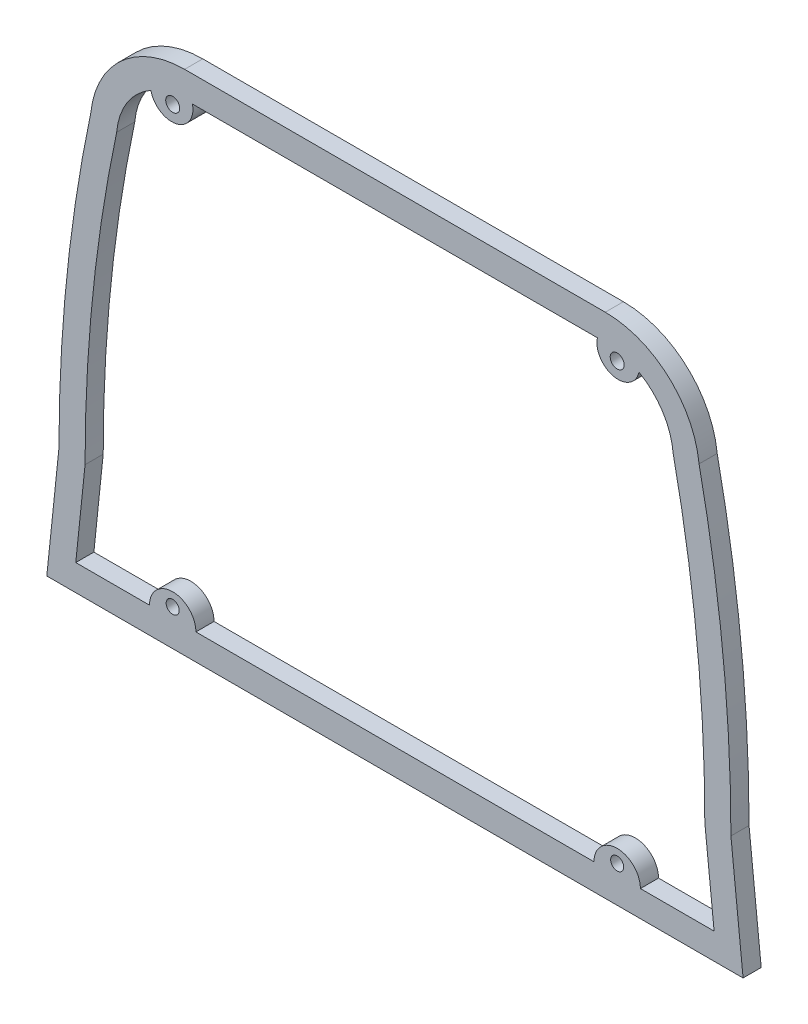
ISO-10303-21;
HEADER;
FILE_DESCRIPTION(('STEP AP214'),'2;1');
FILE_NAME('part.step','',(''),(''),'','','');
FILE_SCHEMA(('AUTOMOTIVE_DESIGN { 1 0 10303 214 1 1 1 1 }'));
ENDSEC;
DATA;
#1=APPLICATION_CONTEXT('core data for automotive mechanical design processes');
#2=APPLICATION_PROTOCOL_DEFINITION('international standard','automotive_design',2000,#1);
#3=PRODUCT_CONTEXT('',#1,'mechanical');
#4=PRODUCT('Part','Part','',(#3));
#5=PRODUCT_RELATED_PRODUCT_CATEGORY('part','',(#4));
#6=PRODUCT_DEFINITION_FORMATION('','',#4);
#7=PRODUCT_DEFINITION_CONTEXT('part definition',#1,'design');
#8=PRODUCT_DEFINITION('design','',#6,#7);
#9=PRODUCT_DEFINITION_SHAPE('','',#8);
#10=(LENGTH_UNIT() NAMED_UNIT(*) SI_UNIT(.MILLI.,.METRE.));
#11=(NAMED_UNIT(*) PLANE_ANGLE_UNIT() SI_UNIT($,.RADIAN.));
#12=(NAMED_UNIT(*) SI_UNIT($,.STERADIAN.) SOLID_ANGLE_UNIT());
#13=UNCERTAINTY_MEASURE_WITH_UNIT(LENGTH_MEASURE(1.E-05),#10,'distance_accuracy_value','');
#14=(GEOMETRIC_REPRESENTATION_CONTEXT(3) GLOBAL_UNCERTAINTY_ASSIGNED_CONTEXT((#13)) GLOBAL_UNIT_ASSIGNED_CONTEXT((#10,
#11,#12)) REPRESENTATION_CONTEXT('',''));
#15=CARTESIAN_POINT('',(0.,0.,0.));
#16=DIRECTION('',(0.,0.,1.));
#17=DIRECTION('',(1.,0.,0.));
#18=AXIS2_PLACEMENT_3D('',#15,#16,#17);
#19=CARTESIAN_POINT('',(100.848111200307,-11.9888000000001,1.5875));
#20=DIRECTION('',(0.,0.,-1.));
#21=DIRECTION('',(-1.,0.,0.));
#22=AXIS2_PLACEMENT_3D('',#19,#20,#21);
#23=CYLINDRICAL_SURFACE('',#22,130.263215676513);
#24=CARTESIAN_POINT('',(100.848111200307,-11.9888000000001,0.));
#25=DIRECTION('',(0.,0.,1.));
#26=DIRECTION('',(1.,0.,0.));
#27=AXIS2_PLACEMENT_3D('',#24,#25,#26);
#28=CIRCLE('',#27,130.263215676513);
#29=CARTESIAN_POINT('',(-29.4151044762055,-11.9888000000001,0.));
#30=VERTEX_POINT('',#29);
#31=CARTESIAN_POINT('',(-26.6256885725934,14.8241768926189,0.));
#32=VERTEX_POINT('',#31);
#33=EDGE_CURVE('E276',#30,#32,#28,.F.);
#34=ORIENTED_EDGE('',*,*,#33,.F.);
#35=DIRECTION('',(0.,0.,-1.));
#36=VECTOR('',#35,1.);
#37=CARTESIAN_POINT('',(-29.4151044762055,-11.9888000000001,1.5875));
#38=LINE('',#37,#36);
#39=CARTESIAN_POINT('',(-29.4151044762055,-11.9888000000001,1.5875));
#40=VERTEX_POINT('',#39);
#41=EDGE_CURVE('E11',#40,#30,#38,.T.);
#42=ORIENTED_EDGE('',*,*,#41,.F.);
#43=CARTESIAN_POINT('',(100.848111200307,-11.9888000000001,1.5875));
#44=DIRECTION('',(0.,0.,1.));
#45=DIRECTION('',(1.,0.,0.));
#46=AXIS2_PLACEMENT_3D('',#43,#44,#45);
#47=CIRCLE('',#46,130.263215676513);
#48=CARTESIAN_POINT('',(-26.6256885725934,14.8241768926189,1.5875));
#49=VERTEX_POINT('',#48);
#50=EDGE_CURVE('E689',#40,#49,#47,.F.);
#51=ORIENTED_EDGE('',*,*,#50,.T.);
#52=DIRECTION('',(0.,0.,-1.));
#53=VECTOR('',#52,1.);
#54=CARTESIAN_POINT('',(-26.6256885725934,14.8241768926189,1.5875));
#55=LINE('',#54,#53);
#56=EDGE_CURVE('E132',#49,#32,#55,.T.);
#57=ORIENTED_EDGE('',*,*,#56,.T.);
#58=EDGE_LOOP('',(#34,#42,#51,#57));
#59=FACE_BOUND('',#58,.T.);
#60=ADVANCED_FACE('F36',(#59),#23,.T.);
#61=CARTESIAN_POINT('',(-33.9203406510145,-55.2949248752893,1.5875));
#62=DIRECTION('',(0.994632171119734,-0.103473881601315,0.));
#63=DIRECTION('',(0.103473881601315,0.994632171119735,0.));
#64=AXIS2_PLACEMENT_3D('',#61,#62,#63);
#65=PLANE('',#64);
#66=DIRECTION('',(-0.103473881601315,-0.994632171119735,0.));
#67=VECTOR('',#66,1.);
#68=CARTESIAN_POINT('',(-33.9203406510145,-55.2949248752893,0.));
#69=LINE('',#68,#67);
#70=CARTESIAN_POINT('',(-30.48,-22.225,0.));
#71=VERTEX_POINT('',#70);
#72=EDGE_CURVE('E278',#30,#71,#69,.T.);
#73=ORIENTED_EDGE('',*,*,#72,.T.);
#74=DIRECTION('',(0.,0.,-1.));
#75=VECTOR('',#74,1.);
#76=CARTESIAN_POINT('',(-30.48,-22.225,1.5875));
#77=LINE('',#76,#75);
#78=CARTESIAN_POINT('',(-30.48,-22.225,1.5875));
#79=VERTEX_POINT('',#78);
#80=EDGE_CURVE('E46',#79,#71,#77,.T.);
#81=ORIENTED_EDGE('',*,*,#80,.F.);
#82=DIRECTION('',(-0.103473881601315,-0.994632171119735,0.));
#83=VECTOR('',#82,1.);
#84=CARTESIAN_POINT('',(-33.9203406510145,-55.2949248752893,1.5875));
#85=LINE('',#84,#83);
#86=EDGE_CURVE('E684',#40,#79,#85,.T.);
#87=ORIENTED_EDGE('',*,*,#86,.F.);
#88=ORIENTED_EDGE('',*,*,#41,.T.);
#89=EDGE_LOOP('',(#73,#81,#87,#88));
#90=FACE_BOUND('',#89,.T.);
#91=ADVANCED_FACE('F418',(#90),#65,.F.);
#92=CARTESIAN_POINT('',(0.,-22.225,1.5875));
#93=DIRECTION('',(0.,1.,0.));
#94=DIRECTION('',(-1.,0.,0.));
#95=AXIS2_PLACEMENT_3D('',#92,#93,#94);
#96=PLANE('',#95);
#97=DIRECTION('',(1.,0.,0.));
#98=VECTOR('',#97,1.);
#99=CARTESIAN_POINT('',(0.,-22.225,0.));
#100=LINE('',#99,#98);
#101=CARTESIAN_POINT('',(30.48,-22.225,0.));
#102=VERTEX_POINT('',#101);
#103=EDGE_CURVE('E281',#71,#102,#100,.T.);
#104=ORIENTED_EDGE('',*,*,#103,.T.);
#105=DIRECTION('',(0.,0.,-1.));
#106=VECTOR('',#105,1.);
#107=CARTESIAN_POINT('',(30.48,-22.225,1.5875));
#108=LINE('',#107,#106);
#109=CARTESIAN_POINT('',(30.48,-22.225,1.5875));
#110=VERTEX_POINT('',#109);
#111=EDGE_CURVE('E312',#110,#102,#108,.T.);
#112=ORIENTED_EDGE('',*,*,#111,.F.);
#113=DIRECTION('',(1.,0.,0.));
#114=VECTOR('',#113,1.);
#115=CARTESIAN_POINT('',(0.,-22.225,1.5875));
#116=LINE('',#115,#114);
#117=EDGE_CURVE('E683',#79,#110,#116,.T.);
#118=ORIENTED_EDGE('',*,*,#117,.F.);
#119=ORIENTED_EDGE('',*,*,#80,.T.);
#120=EDGE_LOOP('',(#104,#112,#118,#119));
#121=FACE_BOUND('',#120,.T.);
#122=ADVANCED_FACE('F423',(#121),#96,.F.);
#123=CARTESIAN_POINT('',(33.9203406510139,-55.2949248752901,1.5875));
#124=DIRECTION('',(0.994632171119737,0.103473881601294,0.));
#125=DIRECTION('',(-0.103473881601294,0.994632171119737,0.));
#126=AXIS2_PLACEMENT_3D('',#123,#124,#125);
#127=PLANE('',#126);
#128=DIRECTION('',(0.103473881601294,-0.994632171119737,0.));
#129=VECTOR('',#128,1.);
#130=CARTESIAN_POINT('',(33.9203406510139,-55.2949248752901,0.));
#131=LINE('',#130,#129);
#132=CARTESIAN_POINT('',(29.4151044762057,-11.9887999999999,0.));
#133=VERTEX_POINT('',#132);
#134=EDGE_CURVE('E284',#133,#102,#131,.T.);
#135=ORIENTED_EDGE('',*,*,#134,.F.);
#136=DIRECTION('',(0.,0.,-1.));
#137=VECTOR('',#136,1.);
#138=CARTESIAN_POINT('',(29.4151044762057,-11.9887999999999,1.5875));
#139=LINE('',#138,#137);
#140=CARTESIAN_POINT('',(29.4151044762057,-11.9887999999999,1.5875));
#141=VERTEX_POINT('',#140);
#142=EDGE_CURVE('E310',#141,#133,#139,.T.);
#143=ORIENTED_EDGE('',*,*,#142,.F.);
#144=DIRECTION('',(0.103473881601294,-0.994632171119737,0.));
#145=VECTOR('',#144,1.);
#146=CARTESIAN_POINT('',(33.9203406510139,-55.2949248752901,1.5875));
#147=LINE('',#146,#145);
#148=EDGE_CURVE('E220',#141,#110,#147,.T.);
#149=ORIENTED_EDGE('',*,*,#148,.T.);
#150=ORIENTED_EDGE('',*,*,#111,.T.);
#151=EDGE_LOOP('',(#135,#143,#149,#150));
#152=FACE_BOUND('',#151,.T.);
#153=ADVANCED_FACE('F641',(#152),#127,.T.);
#154=CARTESIAN_POINT('',(-100.848111200307,-11.9888000000008,1.5875));
#155=DIRECTION('',(0.,0.,-1.));
#156=DIRECTION('',(-1.,0.,0.));
#157=AXIS2_PLACEMENT_3D('',#154,#155,#156);
#158=CYLINDRICAL_SURFACE('',#157,130.263215676513);
#159=CARTESIAN_POINT('',(-100.848111200307,-11.9888000000008,0.));
#160=DIRECTION('',(0.,0.,1.));
#161=DIRECTION('',(1.,0.,0.));
#162=AXIS2_PLACEMENT_3D('',#159,#160,#161);
#163=CIRCLE('',#162,130.263215676513);
#164=CARTESIAN_POINT('',(26.6256885725934,14.824176892619,0.));
#165=VERTEX_POINT('',#164);
#166=EDGE_CURVE('E287',#133,#165,#163,.T.);
#167=ORIENTED_EDGE('',*,*,#166,.T.);
#168=DIRECTION('',(0.,0.,-1.));
#169=VECTOR('',#168,1.);
#170=CARTESIAN_POINT('',(26.6256885725934,14.824176892619,1.5875));
#171=LINE('',#170,#169);
#172=CARTESIAN_POINT('',(26.6256885725934,14.824176892619,1.5875));
#173=VERTEX_POINT('',#172);
#174=EDGE_CURVE('E206',#173,#165,#171,.T.);
#175=ORIENTED_EDGE('',*,*,#174,.F.);
#176=CARTESIAN_POINT('',(-100.848111200307,-11.9888000000008,1.5875));
#177=DIRECTION('',(0.,0.,1.));
#178=DIRECTION('',(1.,0.,0.));
#179=AXIS2_PLACEMENT_3D('',#176,#177,#178);
#180=CIRCLE('',#179,130.263215676513);
#181=EDGE_CURVE('E217',#141,#173,#180,.T.);
#182=ORIENTED_EDGE('',*,*,#181,.F.);
#183=ORIENTED_EDGE('',*,*,#142,.T.);
#184=EDGE_LOOP('',(#167,#175,#182,#183));
#185=FACE_BOUND('',#184,.T.);
#186=ADVANCED_FACE('F633',(#185),#158,.T.);
#187=CARTESIAN_POINT('',(18.415,13.97,1.5875));
#188=DIRECTION('',(0.,0.,-1.));
#189=DIRECTION('',(-1.,0.,0.));
#190=AXIS2_PLACEMENT_3D('',#187,#188,#189);
#191=CYLINDRICAL_SURFACE('',#190,8.25500000000002);
#192=CARTESIAN_POINT('',(18.415,13.97,0.));
#193=DIRECTION('',(0.,0.,1.));
#194=DIRECTION('',(1.,0.,0.));
#195=AXIS2_PLACEMENT_3D('',#192,#193,#194);
#196=CIRCLE('',#195,8.25500000000002);
#197=CARTESIAN_POINT('',(18.415,22.225,0.));
#198=VERTEX_POINT('',#197);
#199=EDGE_CURVE('E203',#198,#165,#196,.F.);
#200=ORIENTED_EDGE('',*,*,#199,.F.);
#201=DIRECTION('',(0.,0.,-1.));
#202=VECTOR('',#201,1.);
#203=CARTESIAN_POINT('',(18.415,22.225,1.5875));
#204=LINE('',#203,#202);
#205=CARTESIAN_POINT('',(18.415,22.225,1.5875));
#206=VERTEX_POINT('',#205);
#207=EDGE_CURVE('E197',#206,#198,#204,.T.);
#208=ORIENTED_EDGE('',*,*,#207,.F.);
#209=CARTESIAN_POINT('',(18.415,13.97,1.5875));
#210=DIRECTION('',(0.,0.,1.));
#211=DIRECTION('',(1.,0.,0.));
#212=AXIS2_PLACEMENT_3D('',#209,#210,#211);
#213=CIRCLE('',#212,8.25500000000002);
#214=EDGE_CURVE('E201',#206,#173,#213,.F.);
#215=ORIENTED_EDGE('',*,*,#214,.T.);
#216=ORIENTED_EDGE('',*,*,#174,.T.);
#217=EDGE_LOOP('',(#200,#208,#215,#216));
#218=FACE_BOUND('',#217,.T.);
#219=ADVANCED_FACE('F199',(#218),#191,.T.);
#220=CARTESIAN_POINT('',(0.,22.225,1.5875));
#221=DIRECTION('',(0.,-1.,0.));
#222=DIRECTION('',(1.,0.,0.));
#223=AXIS2_PLACEMENT_3D('',#220,#221,#222);
#224=PLANE('',#223);
#225=DIRECTION('',(-1.,0.,0.));
#226=VECTOR('',#225,1.);
#227=CARTESIAN_POINT('',(0.,22.225,0.));
#228=LINE('',#227,#226);
#229=CARTESIAN_POINT('',(-18.415,22.225,0.));
#230=VERTEX_POINT('',#229);
#231=EDGE_CURVE('E291',#198,#230,#228,.T.);
#232=ORIENTED_EDGE('',*,*,#231,.T.);
#233=DIRECTION('',(0.,0.,-1.));
#234=VECTOR('',#233,1.);
#235=CARTESIAN_POINT('',(-18.415,22.225,1.5875));
#236=LINE('',#235,#234);
#237=CARTESIAN_POINT('',(-18.415,22.225,1.5875));
#238=VERTEX_POINT('',#237);
#239=EDGE_CURVE('E207',#238,#230,#236,.T.);
#240=ORIENTED_EDGE('',*,*,#239,.F.);
#241=DIRECTION('',(-1.,0.,0.));
#242=VECTOR('',#241,1.);
#243=CARTESIAN_POINT('',(0.,22.225,1.5875));
#244=LINE('',#243,#242);
#245=EDGE_CURVE('E210',#206,#238,#244,.T.);
#246=ORIENTED_EDGE('',*,*,#245,.F.);
#247=ORIENTED_EDGE('',*,*,#207,.T.);
#248=EDGE_LOOP('',(#232,#240,#246,#247));
#249=FACE_BOUND('',#248,.T.);
#250=ADVANCED_FACE('F211',(#249),#224,.F.);
#251=CARTESIAN_POINT('',(-18.415,13.97,1.5875));
#252=DIRECTION('',(0.,0.,-1.));
#253=DIRECTION('',(-1.,0.,0.));
#254=AXIS2_PLACEMENT_3D('',#251,#252,#253);
#255=CYLINDRICAL_SURFACE('',#254,5.96900000000001);
#256=CARTESIAN_POINT('',(-18.415,13.97,0.));
#257=DIRECTION('',(0.,0.,1.));
#258=DIRECTION('',(1.,0.,0.));
#259=AXIS2_PLACEMENT_3D('',#256,#257,#258);
#260=CIRCLE('',#259,5.96900000000001);
#261=CARTESIAN_POINT('',(-21.365471992299,19.1588029469868,0.));
#262=VERTEX_POINT('',#261);
#263=CARTESIAN_POINT('',(-24.3622943207271,14.4785776859514,0.));
#264=VERTEX_POINT('',#263);
#265=EDGE_CURVE('E238',#262,#264,#260,.T.);
#266=ORIENTED_EDGE('',*,*,#265,.F.);
#267=DIRECTION('',(0.,0.,-1.));
#268=VECTOR('',#267,1.);
#269=CARTESIAN_POINT('',(-21.365471992299,19.1588029469868,1.5875));
#270=LINE('',#269,#268);
#271=CARTESIAN_POINT('',(-21.365471992299,19.1588029469868,1.5875));
#272=VERTEX_POINT('',#271);
#273=EDGE_CURVE('E40',#272,#262,#270,.T.);
#274=ORIENTED_EDGE('',*,*,#273,.F.);
#275=CARTESIAN_POINT('',(-18.415,13.97,1.5875));
#276=DIRECTION('',(0.,0.,1.));
#277=DIRECTION('',(1.,0.,0.));
#278=AXIS2_PLACEMENT_3D('',#275,#276,#277);
#279=CIRCLE('',#278,5.96900000000001);
#280=CARTESIAN_POINT('',(-24.3622943207271,14.4785776859514,1.5875));
#281=VERTEX_POINT('',#280);
#282=EDGE_CURVE('E306',#272,#281,#279,.T.);
#283=ORIENTED_EDGE('',*,*,#282,.T.);
#284=DIRECTION('',(0.,0.,-1.));
#285=VECTOR('',#284,1.);
#286=CARTESIAN_POINT('',(-24.3622943207271,14.4785776859514,1.5875));
#287=LINE('',#286,#285);
#288=EDGE_CURVE('E237',#281,#264,#287,.T.);
#289=ORIENTED_EDGE('',*,*,#288,.T.);
#290=EDGE_LOOP('',(#266,#274,#283,#289));
#291=FACE_BOUND('',#290,.T.);
#292=ADVANCED_FACE('F38',(#291),#255,.F.);
#293=CARTESIAN_POINT('',(-19.545370171903,19.5489014734934,1.5875));
#294=DIRECTION('',(0.,0.,-1.));
#295=DIRECTION('',(-1.,0.,0.));
#296=AXIS2_PLACEMENT_3D('',#293,#294,#295);
#297=CYLINDRICAL_SURFACE('',#296,1.86143694413519);
#298=CARTESIAN_POINT('',(-19.545370171903,19.5489014734934,0.));
#299=DIRECTION('',(0.,0.,1.));
#300=DIRECTION('',(1.,0.,0.));
#301=AXIS2_PLACEMENT_3D('',#298,#299,#300);
#302=CIRCLE('',#301,1.86143694413519);
#303=CARTESIAN_POINT('',(-17.7252683515071,19.939,0.));
#304=VERTEX_POINT('',#303);
#305=EDGE_CURVE('E241',#262,#304,#302,.T.);
#306=ORIENTED_EDGE('',*,*,#305,.T.);
#307=DIRECTION('',(0.,0.,-1.));
#308=VECTOR('',#307,1.);
#309=CARTESIAN_POINT('',(-17.7252683515071,19.939,1.5875));
#310=LINE('',#309,#308);
#311=CARTESIAN_POINT('',(-17.7252683515071,19.939,1.5875));
#312=VERTEX_POINT('',#311);
#313=EDGE_CURVE('E338',#312,#304,#310,.T.);
#314=ORIENTED_EDGE('',*,*,#313,.F.);
#315=CARTESIAN_POINT('',(-19.545370171903,19.5489014734934,1.5875));
#316=DIRECTION('',(0.,0.,1.));
#317=DIRECTION('',(1.,0.,0.));
#318=AXIS2_PLACEMENT_3D('',#315,#316,#317);
#319=CIRCLE('',#318,1.86143694413519);
#320=EDGE_CURVE('E346',#272,#312,#319,.T.);
#321=ORIENTED_EDGE('',*,*,#320,.F.);
#322=ORIENTED_EDGE('',*,*,#273,.T.);
#323=EDGE_LOOP('',(#306,#314,#321,#322));
#324=FACE_BOUND('',#323,.T.);
#325=ADVANCED_FACE('F345',(#324),#297,.T.);
#326=CARTESIAN_POINT('',(0.,19.939,1.5875));
#327=DIRECTION('',(0.,-1.,0.));
#328=DIRECTION('',(1.,0.,0.));
#329=AXIS2_PLACEMENT_3D('',#326,#327,#328);
#330=PLANE('',#329);
#331=DIRECTION('',(-1.,0.,0.));
#332=VECTOR('',#331,1.);
#333=CARTESIAN_POINT('',(0.,19.939,0.));
#334=LINE('',#333,#332);
#335=CARTESIAN_POINT('',(17.725268351507,19.939,0.));
#336=VERTEX_POINT('',#335);
#337=EDGE_CURVE('E244',#336,#304,#334,.T.);
#338=ORIENTED_EDGE('',*,*,#337,.F.);
#339=DIRECTION('',(0.,0.,-1.));
#340=VECTOR('',#339,1.);
#341=CARTESIAN_POINT('',(17.725268351507,19.939,1.5875));
#342=LINE('',#341,#340);
#343=CARTESIAN_POINT('',(17.725268351507,19.939,1.5875));
#344=VERTEX_POINT('',#343);
#345=EDGE_CURVE('E337',#344,#336,#342,.T.);
#346=ORIENTED_EDGE('',*,*,#345,.F.);
#347=DIRECTION('',(-1.,0.,0.));
#348=VECTOR('',#347,1.);
#349=CARTESIAN_POINT('',(0.,19.939,1.5875));
#350=LINE('',#349,#348);
#351=EDGE_CURVE('E706',#344,#312,#350,.T.);
#352=ORIENTED_EDGE('',*,*,#351,.T.);
#353=ORIENTED_EDGE('',*,*,#313,.T.);
#354=EDGE_LOOP('',(#338,#346,#352,#353));
#355=FACE_BOUND('',#354,.T.);
#356=ADVANCED_FACE('F409',(#355),#330,.T.);
#357=CARTESIAN_POINT('',(19.545370171903,19.5489014734936,1.5875));
#358=DIRECTION('',(0.,0.,-1.));
#359=DIRECTION('',(-1.,0.,0.));
#360=AXIS2_PLACEMENT_3D('',#357,#358,#359);
#361=CYLINDRICAL_SURFACE('',#360,1.86143694413519);
#362=CARTESIAN_POINT('',(19.545370171903,19.5489014734936,0.));
#363=DIRECTION('',(0.,0.,1.));
#364=DIRECTION('',(1.,0.,0.));
#365=AXIS2_PLACEMENT_3D('',#362,#363,#364);
#366=CIRCLE('',#365,1.86143694413519);
#367=CARTESIAN_POINT('',(21.365471992299,19.1588029469869,0.));
#368=VERTEX_POINT('',#367);
#369=EDGE_CURVE('E247',#368,#336,#366,.F.);
#370=ORIENTED_EDGE('',*,*,#369,.F.);
#371=DIRECTION('',(0.,0.,-1.));
#372=VECTOR('',#371,1.);
#373=CARTESIAN_POINT('',(21.365471992299,19.1588029469869,1.5875));
#374=LINE('',#373,#372);
#375=CARTESIAN_POINT('',(21.365471992299,19.1588029469869,1.5875));
#376=VERTEX_POINT('',#375);
#377=EDGE_CURVE('E335',#376,#368,#374,.T.);
#378=ORIENTED_EDGE('',*,*,#377,.F.);
#379=CARTESIAN_POINT('',(19.545370171903,19.5489014734936,1.5875));
#380=DIRECTION('',(0.,0.,1.));
#381=DIRECTION('',(1.,0.,0.));
#382=AXIS2_PLACEMENT_3D('',#379,#380,#381);
#383=CIRCLE('',#382,1.86143694413519);
#384=EDGE_CURVE('E407',#376,#344,#383,.F.);
#385=ORIENTED_EDGE('',*,*,#384,.T.);
#386=ORIENTED_EDGE('',*,*,#345,.T.);
#387=EDGE_LOOP('',(#370,#378,#385,#386));
#388=FACE_BOUND('',#387,.T.);
#389=ADVANCED_FACE('F404',(#388),#361,.T.);
#390=CARTESIAN_POINT('',(18.415,13.97,1.5875));
#391=DIRECTION('',(0.,0.,-1.));
#392=DIRECTION('',(-1.,0.,0.));
#393=AXIS2_PLACEMENT_3D('',#390,#391,#392);
#394=CYLINDRICAL_SURFACE('',#393,5.96900000000002);
#395=CARTESIAN_POINT('',(18.415,13.97,0.));
#396=DIRECTION('',(0.,0.,1.));
#397=DIRECTION('',(1.,0.,0.));
#398=AXIS2_PLACEMENT_3D('',#395,#396,#397);
#399=CIRCLE('',#398,5.96900000000002);
#400=CARTESIAN_POINT('',(24.362294320727,14.4785776859518,0.));
#401=VERTEX_POINT('',#400);
#402=EDGE_CURVE('E250',#368,#401,#399,.F.);
#403=ORIENTED_EDGE('',*,*,#402,.T.);
#404=DIRECTION('',(0.,0.,-1.));
#405=VECTOR('',#404,1.);
#406=CARTESIAN_POINT('',(24.362294320727,14.4785776859518,1.5875));
#407=LINE('',#406,#405);
#408=CARTESIAN_POINT('',(24.362294320727,14.4785776859518,1.5875));
#409=VERTEX_POINT('',#408);
#410=EDGE_CURVE('E333',#409,#401,#407,.T.);
#411=ORIENTED_EDGE('',*,*,#410,.F.);
#412=CARTESIAN_POINT('',(18.415,13.97,1.5875));
#413=DIRECTION('',(0.,0.,1.));
#414=DIRECTION('',(1.,0.,0.));
#415=AXIS2_PLACEMENT_3D('',#412,#413,#414);
#416=CIRCLE('',#415,5.96900000000002);
#417=EDGE_CURVE('E703',#376,#409,#416,.F.);
#418=ORIENTED_EDGE('',*,*,#417,.F.);
#419=ORIENTED_EDGE('',*,*,#377,.T.);
#420=EDGE_LOOP('',(#403,#411,#418,#419));
#421=FACE_BOUND('',#420,.T.);
#422=ADVANCED_FACE('F401',(#421),#394,.F.);
#423=CARTESIAN_POINT('',(-100.848111200307,-11.9888000000008,1.5875));
#424=DIRECTION('',(0.,0.,-1.));
#425=DIRECTION('',(-1.,0.,0.));
#426=AXIS2_PLACEMENT_3D('',#423,#424,#425);
#427=CYLINDRICAL_SURFACE('',#426,127.977215676513);
#428=CARTESIAN_POINT('',(-100.848111200307,-11.9888000000008,0.));
#429=DIRECTION('',(0.,0.,1.));
#430=DIRECTION('',(1.,0.,0.));
#431=AXIS2_PLACEMENT_3D('',#428,#429,#430);
#432=CIRCLE('',#431,127.977215676513);
#433=CARTESIAN_POINT('',(27.1290500155386,-12.1068654315829,0.));
#434=VERTEX_POINT('',#433);
#435=EDGE_CURVE('E253',#434,#401,#432,.T.);
#436=ORIENTED_EDGE('',*,*,#435,.F.);
#437=DIRECTION('',(0.,0.,-1.));
#438=VECTOR('',#437,1.);
#439=CARTESIAN_POINT('',(27.1290500155386,-12.1068654315829,1.5875));
#440=LINE('',#439,#438);
#441=CARTESIAN_POINT('',(27.1290500155386,-12.1068654315829,1.5875));
#442=VERTEX_POINT('',#441);
#443=EDGE_CURVE('E331',#442,#434,#440,.T.);
#444=ORIENTED_EDGE('',*,*,#443,.F.);
#445=CARTESIAN_POINT('',(-100.848111200307,-11.9888000000008,1.5875));
#446=DIRECTION('',(0.,0.,1.));
#447=DIRECTION('',(1.,0.,0.));
#448=AXIS2_PLACEMENT_3D('',#445,#446,#447);
#449=CIRCLE('',#448,127.977215676513);
#450=EDGE_CURVE('E398',#442,#409,#449,.T.);
#451=ORIENTED_EDGE('',*,*,#450,.T.);
#452=ORIENTED_EDGE('',*,*,#410,.T.);
#453=EDGE_LOOP('',(#436,#444,#451,#452));
#454=FACE_BOUND('',#453,.T.);
#455=ADVANCED_FACE('F393',(#454),#427,.F.);
#456=CARTESIAN_POINT('',(31.6466115078347,-55.5314661686301,1.5875));
#457=DIRECTION('',(0.994632171119735,0.103473881601311,0.));
#458=DIRECTION('',(-0.103473881601311,0.994632171119735,0.));
#459=AXIS2_PLACEMENT_3D('',#456,#457,#458);
#460=PLANE('',#459);
#461=DIRECTION('',(0.103473881601311,-0.994632171119735,0.));
#462=VECTOR('',#461,1.);
#463=CARTESIAN_POINT('',(31.6466115078347,-55.5314661686301,0.));
#464=LINE('',#463,#462);
#465=CARTESIAN_POINT('',(27.9438450609326,-19.939,0.));
#466=VERTEX_POINT('',#465);
#467=EDGE_CURVE('E256',#434,#466,#464,.T.);
#468=ORIENTED_EDGE('',*,*,#467,.T.);
#469=DIRECTION('',(0.,0.,-1.));
#470=VECTOR('',#469,1.);
#471=CARTESIAN_POINT('',(27.9438450609326,-19.939,1.5875));
#472=LINE('',#471,#470);
#473=CARTESIAN_POINT('',(27.9438450609326,-19.939,1.5875));
#474=VERTEX_POINT('',#473);
#475=EDGE_CURVE('E329',#474,#466,#472,.T.);
#476=ORIENTED_EDGE('',*,*,#475,.F.);
#477=DIRECTION('',(0.103473881601311,-0.994632171119735,0.));
#478=VECTOR('',#477,1.);
#479=CARTESIAN_POINT('',(31.6466115078347,-55.5314661686301,1.5875));
#480=LINE('',#479,#478);
#481=EDGE_CURVE('E700',#442,#474,#480,.T.);
#482=ORIENTED_EDGE('',*,*,#481,.F.);
#483=ORIENTED_EDGE('',*,*,#443,.T.);
#484=EDGE_LOOP('',(#468,#476,#482,#483));
#485=FACE_BOUND('',#484,.T.);
#486=ADVANCED_FACE('F443',(#485),#460,.F.);
#487=CARTESIAN_POINT('',(0.,-19.939,1.5875));
#488=DIRECTION('',(0.,1.,0.));
#489=DIRECTION('',(0.,0.,1.));
#490=AXIS2_PLACEMENT_3D('',#487,#488,#489);
#491=PLANE('',#490);
#492=DIRECTION('',(1.,0.,0.));
#493=VECTOR('',#492,1.);
#494=CARTESIAN_POINT('',(0.,-19.939,0.));
#495=LINE('',#494,#493);
#496=CARTESIAN_POINT('',(21.4895288552225,-19.939,0.));
#497=VERTEX_POINT('',#496);
#498=EDGE_CURVE('E259',#497,#466,#495,.T.);
#499=ORIENTED_EDGE('',*,*,#498,.F.);
#500=DIRECTION('',(0.,0.,-1.));
#501=VECTOR('',#500,1.);
#502=CARTESIAN_POINT('',(21.4895288552225,-19.939,1.5875));
#503=LINE('',#502,#501);
#504=CARTESIAN_POINT('',(21.4895288552225,-19.939,1.5875));
#505=VERTEX_POINT('',#504);
#506=EDGE_CURVE('E327',#505,#497,#503,.T.);
#507=ORIENTED_EDGE('',*,*,#506,.F.);
#508=DIRECTION('',(1.,0.,0.));
#509=VECTOR('',#508,1.);
#510=CARTESIAN_POINT('',(0.,-19.939,1.5875));
#511=LINE('',#510,#509);
#512=EDGE_CURVE('E386',#505,#474,#511,.T.);
#513=ORIENTED_EDGE('',*,*,#512,.T.);
#514=ORIENTED_EDGE('',*,*,#475,.T.);
#515=EDGE_LOOP('',(#499,#507,#513,#514));
#516=FACE_BOUND('',#515,.T.);
#517=ADVANCED_FACE('F385',(#516),#491,.T.);
#518=CARTESIAN_POINT('',(19.4575288552225,-19.9389999999999,1.5875));
#519=DIRECTION('',(0.,0.,-1.));
#520=DIRECTION('',(-1.,0.,0.));
#521=AXIS2_PLACEMENT_3D('',#518,#519,#520);
#522=CYLINDRICAL_SURFACE('',#521,2.032);
#523=CARTESIAN_POINT('',(19.4575288552225,-19.9389999999999,0.));
#524=DIRECTION('',(0.,0.,1.));
#525=DIRECTION('',(1.,0.,0.));
#526=AXIS2_PLACEMENT_3D('',#523,#524,#525);
#527=CIRCLE('',#526,2.032);
#528=CARTESIAN_POINT('',(17.4255288552225,-19.939,0.));
#529=VERTEX_POINT('',#528);
#530=EDGE_CURVE('E262',#497,#529,#527,.T.);
#531=ORIENTED_EDGE('',*,*,#530,.T.);
#532=DIRECTION('',(0.,0.,-1.));
#533=VECTOR('',#532,1.);
#534=CARTESIAN_POINT('',(17.4255288552225,-19.939,1.5875));
#535=LINE('',#534,#533);
#536=CARTESIAN_POINT('',(17.4255288552225,-19.939,1.5875));
#537=VERTEX_POINT('',#536);
#538=EDGE_CURVE('E325',#537,#529,#535,.T.);
#539=ORIENTED_EDGE('',*,*,#538,.F.);
#540=CARTESIAN_POINT('',(19.4575288552225,-19.9389999999999,1.5875));
#541=DIRECTION('',(0.,0.,1.));
#542=DIRECTION('',(1.,0.,0.));
#543=AXIS2_PLACEMENT_3D('',#540,#541,#542);
#544=CIRCLE('',#543,2.032);
#545=EDGE_CURVE('E381',#505,#537,#544,.T.);
#546=ORIENTED_EDGE('',*,*,#545,.F.);
#547=ORIENTED_EDGE('',*,*,#506,.T.);
#548=EDGE_LOOP('',(#531,#539,#546,#547));
#549=FACE_BOUND('',#548,.T.);
#550=ADVANCED_FACE('F380',(#549),#522,.T.);
#551=CARTESIAN_POINT('',(-17.4255288552222,-19.939,0.));
#552=VERTEX_POINT('',#551);
#553=EDGE_CURVE('E264',#552,#529,#495,.T.);
#554=ORIENTED_EDGE('',*,*,#553,.F.);
#555=DIRECTION('',(0.,0.,-1.));
#556=VECTOR('',#555,1.);
#557=CARTESIAN_POINT('',(-17.4255288552222,-19.939,1.5875));
#558=LINE('',#557,#556);
#559=CARTESIAN_POINT('',(-17.4255288552222,-19.939,1.5875));
#560=VERTEX_POINT('',#559);
#561=EDGE_CURVE('E323',#560,#552,#558,.T.);
#562=ORIENTED_EDGE('',*,*,#561,.F.);
#563=EDGE_CURVE('E377',#560,#537,#511,.T.);
#564=ORIENTED_EDGE('',*,*,#563,.T.);
#565=ORIENTED_EDGE('',*,*,#538,.T.);
#566=EDGE_LOOP('',(#554,#562,#564,#565));
#567=FACE_BOUND('',#566,.T.);
#568=ADVANCED_FACE('F373',(#567),#491,.T.);
#569=CARTESIAN_POINT('',(-19.4575288552222,-19.939,1.5875));
#570=DIRECTION('',(0.,0.,-1.));
#571=DIRECTION('',(-1.,0.,0.));
#572=AXIS2_PLACEMENT_3D('',#569,#570,#571);
#573=CYLINDRICAL_SURFACE('',#572,2.032);
#574=CARTESIAN_POINT('',(-19.4575288552222,-19.939,0.));
#575=DIRECTION('',(0.,0.,1.));
#576=DIRECTION('',(1.,0.,0.));
#577=AXIS2_PLACEMENT_3D('',#574,#575,#576);
#578=CIRCLE('',#577,2.032);
#579=CARTESIAN_POINT('',(-21.4895288552222,-19.939,0.));
#580=VERTEX_POINT('',#579);
#581=EDGE_CURVE('E267',#580,#552,#578,.F.);
#582=ORIENTED_EDGE('',*,*,#581,.F.);
#583=DIRECTION('',(0.,0.,-1.));
#584=VECTOR('',#583,1.);
#585=CARTESIAN_POINT('',(-21.4895288552222,-19.939,1.5875));
#586=LINE('',#585,#584);
#587=CARTESIAN_POINT('',(-21.4895288552222,-19.939,1.5875));
#588=VERTEX_POINT('',#587);
#589=EDGE_CURVE('E321',#588,#580,#586,.T.);
#590=ORIENTED_EDGE('',*,*,#589,.F.);
#591=CARTESIAN_POINT('',(-19.4575288552222,-19.939,1.5875));
#592=DIRECTION('',(0.,0.,1.));
#593=DIRECTION('',(1.,0.,0.));
#594=AXIS2_PLACEMENT_3D('',#591,#592,#593);
#595=CIRCLE('',#594,2.032);
#596=EDGE_CURVE('E695',#588,#560,#595,.F.);
#597=ORIENTED_EDGE('',*,*,#596,.T.);
#598=ORIENTED_EDGE('',*,*,#561,.T.);
#599=EDGE_LOOP('',(#582,#590,#597,#598));
#600=FACE_BOUND('',#599,.T.);
#601=ADVANCED_FACE('F437',(#600),#573,.T.);
#602=CARTESIAN_POINT('',(-27.9438450609326,-19.939,0.));
#603=VERTEX_POINT('',#602);
#604=EDGE_CURVE('E263',#603,#580,#495,.T.);
#605=ORIENTED_EDGE('',*,*,#604,.F.);
#606=DIRECTION('',(0.,0.,-1.));
#607=VECTOR('',#606,1.);
#608=CARTESIAN_POINT('',(-27.9438450609326,-19.939,1.5875));
#609=LINE('',#608,#607);
#610=CARTESIAN_POINT('',(-27.9438450609326,-19.939,1.5875));
#611=VERTEX_POINT('',#610);
#612=EDGE_CURVE('E319',#611,#603,#609,.T.);
#613=ORIENTED_EDGE('',*,*,#612,.F.);
#614=EDGE_CURVE('E694',#611,#588,#511,.T.);
#615=ORIENTED_EDGE('',*,*,#614,.T.);
#616=ORIENTED_EDGE('',*,*,#589,.T.);
#617=EDGE_LOOP('',(#605,#613,#615,#616));
#618=FACE_BOUND('',#617,.T.);
#619=ADVANCED_FACE('F366',(#618),#491,.T.);
#620=CARTESIAN_POINT('',(-31.6466115078347,-55.53146616863,1.5875));
#621=DIRECTION('',(0.994632171119735,-0.103473881601311,0.));
#622=DIRECTION('',(0.103473881601311,0.994632171119735,0.));
#623=AXIS2_PLACEMENT_3D('',#620,#621,#622);
#624=PLANE('',#623);
#625=DIRECTION('',(-0.103473881601311,-0.994632171119735,0.));
#626=VECTOR('',#625,1.);
#627=CARTESIAN_POINT('',(-31.6466115078347,-55.53146616863,0.));
#628=LINE('',#627,#626);
#629=CARTESIAN_POINT('',(-27.1290500155383,-12.1068654315809,0.));
#630=VERTEX_POINT('',#629);
#631=EDGE_CURVE('E270',#630,#603,#628,.T.);
#632=ORIENTED_EDGE('',*,*,#631,.F.);
#633=DIRECTION('',(0.,0.,-1.));
#634=VECTOR('',#633,1.);
#635=CARTESIAN_POINT('',(-27.1290500155383,-12.1068654315809,1.5875));
#636=LINE('',#635,#634);
#637=CARTESIAN_POINT('',(-27.1290500155383,-12.1068654315809,1.5875));
#638=VERTEX_POINT('',#637);
#639=EDGE_CURVE('E317',#638,#630,#636,.T.);
#640=ORIENTED_EDGE('',*,*,#639,.F.);
#641=DIRECTION('',(-0.103473881601311,-0.994632171119735,0.));
#642=VECTOR('',#641,1.);
#643=CARTESIAN_POINT('',(-31.6466115078347,-55.53146616863,1.5875));
#644=LINE('',#643,#642);
#645=EDGE_CURVE('E362',#638,#611,#644,.T.);
#646=ORIENTED_EDGE('',*,*,#645,.T.);
#647=ORIENTED_EDGE('',*,*,#612,.T.);
#648=EDGE_LOOP('',(#632,#640,#646,#647));
#649=FACE_BOUND('',#648,.T.);
#650=ADVANCED_FACE('F358',(#649),#624,.T.);
#651=CARTESIAN_POINT('',(19.4575288552223,-19.05,1.5875));
#652=DIRECTION('',(0.,0.,-1.));
#653=DIRECTION('',(-1.,0.,0.));
#654=AXIS2_PLACEMENT_3D('',#651,#652,#653);
#655=CYLINDRICAL_SURFACE('',#654,0.571499999999999);
#656=CARTESIAN_POINT('',(19.4575288552223,-19.05,1.5875));
#657=DIRECTION('',(0.,0.,1.));
#658=DIRECTION('',(1.,0.,0.));
#659=AXIS2_PLACEMENT_3D('',#656,#657,#658);
#660=CIRCLE('',#659,0.571499999999999);
#661=CARTESIAN_POINT('',(20.0290288552223,-19.05,1.5875));
#662=VERTEX_POINT('',#661);
#663=EDGE_CURVE('E231',#662,#662,#660,.T.);
#664=ORIENTED_EDGE('',*,*,#663,.T.);
#665=EDGE_LOOP('',(#664));
#666=FACE_BOUND('',#665,.T.);
#667=CARTESIAN_POINT('',(19.4575288552223,-19.05,0.));
#668=DIRECTION('',(0.,0.,1.));
#669=DIRECTION('',(1.,0.,0.));
#670=AXIS2_PLACEMENT_3D('',#667,#668,#669);
#671=CIRCLE('',#670,0.571499999999999);
#672=CARTESIAN_POINT('',(20.0290288552223,-19.05,0.));
#673=VERTEX_POINT('',#672);
#674=EDGE_CURVE('E300',#673,#673,#671,.T.);
#675=ORIENTED_EDGE('',*,*,#674,.F.);
#676=EDGE_LOOP('',(#675));
#677=FACE_BOUND('',#676,.T.);
#678=ADVANCED_FACE('F434',(#666,#677),#655,.F.);
#679=CARTESIAN_POINT('',(-19.4575288552221,19.05,1.5875));
#680=DIRECTION('',(0.,0.,-1.));
#681=DIRECTION('',(-1.,0.,0.));
#682=AXIS2_PLACEMENT_3D('',#679,#680,#681);
#683=CYLINDRICAL_SURFACE('',#682,0.609599999999999);
#684=CARTESIAN_POINT('',(-19.4575288552221,19.05,1.5875));
#685=DIRECTION('',(0.,0.,1.));
#686=DIRECTION('',(1.,0.,0.));
#687=AXIS2_PLACEMENT_3D('',#684,#685,#686);
#688=CIRCLE('',#687,0.609599999999999);
#689=CARTESIAN_POINT('',(-18.8479288552221,19.05,1.5875));
#690=VERTEX_POINT('',#689);
#691=EDGE_CURVE('E228',#690,#690,#688,.T.);
#692=ORIENTED_EDGE('',*,*,#691,.T.);
#693=EDGE_LOOP('',(#692));
#694=FACE_BOUND('',#693,.T.);
#695=CARTESIAN_POINT('',(-19.4575288552221,19.05,0.));
#696=DIRECTION('',(0.,0.,1.));
#697=DIRECTION('',(1.,0.,0.));
#698=AXIS2_PLACEMENT_3D('',#695,#696,#697);
#699=CIRCLE('',#698,0.609599999999999);
#700=CARTESIAN_POINT('',(-18.8479288552221,19.05,0.));
#701=VERTEX_POINT('',#700);
#702=EDGE_CURVE('E297',#701,#701,#699,.T.);
#703=ORIENTED_EDGE('',*,*,#702,.F.);
#704=EDGE_LOOP('',(#703));
#705=FACE_BOUND('',#704,.T.);
#706=ADVANCED_FACE('F493',(#694,#705),#683,.F.);
#707=CARTESIAN_POINT('',(19.4575288552221,19.05,1.5875));
#708=DIRECTION('',(0.,0.,-1.));
#709=DIRECTION('',(-1.,0.,0.));
#710=AXIS2_PLACEMENT_3D('',#707,#708,#709);
#711=CYLINDRICAL_SURFACE('',#710,0.609599999999999);
#712=CARTESIAN_POINT('',(19.4575288552221,19.05,1.5875));
#713=DIRECTION('',(0.,0.,1.));
#714=DIRECTION('',(1.,0.,0.));
#715=AXIS2_PLACEMENT_3D('',#712,#713,#714);
#716=CIRCLE('',#715,0.609599999999999);
#717=CARTESIAN_POINT('',(20.0671288552221,19.05,1.5875));
#718=VERTEX_POINT('',#717);
#719=EDGE_CURVE('E225',#718,#718,#716,.F.);
#720=ORIENTED_EDGE('',*,*,#719,.F.);
#721=EDGE_LOOP('',(#720));
#722=FACE_BOUND('',#721,.T.);
#723=CARTESIAN_POINT('',(19.4575288552221,19.05,0.));
#724=DIRECTION('',(0.,0.,1.));
#725=DIRECTION('',(1.,0.,0.));
#726=AXIS2_PLACEMENT_3D('',#723,#724,#725);
#727=CIRCLE('',#726,0.609599999999999);
#728=CARTESIAN_POINT('',(20.0671288552221,19.05,0.));
#729=VERTEX_POINT('',#728);
#730=EDGE_CURVE('E294',#729,#729,#727,.F.);
#731=ORIENTED_EDGE('',*,*,#730,.T.);
#732=EDGE_LOOP('',(#731));
#733=FACE_BOUND('',#732,.T.);
#734=ADVANCED_FACE('F501',(#722,#733),#711,.F.);
#735=CARTESIAN_POINT('',(-18.415,13.97,1.5875));
#736=DIRECTION('',(0.,0.,-1.));
#737=DIRECTION('',(-1.,0.,0.));
#738=AXIS2_PLACEMENT_3D('',#735,#736,#737);
#739=CYLINDRICAL_SURFACE('',#738,8.255);
#740=CARTESIAN_POINT('',(-18.415,13.97,0.));
#741=DIRECTION('',(0.,0.,1.));
#742=DIRECTION('',(1.,0.,0.));
#743=AXIS2_PLACEMENT_3D('',#740,#741,#742);
#744=CIRCLE('',#743,8.255);
#745=EDGE_CURVE('E125',#230,#32,#744,.T.);
#746=ORIENTED_EDGE('',*,*,#745,.T.);
#747=ORIENTED_EDGE('',*,*,#56,.F.);
#748=CARTESIAN_POINT('',(-18.415,13.97,1.5875));
#749=DIRECTION('',(0.,0.,1.));
#750=DIRECTION('',(1.,0.,0.));
#751=AXIS2_PLACEMENT_3D('',#748,#749,#750);
#752=CIRCLE('',#751,8.255);
#753=EDGE_CURVE('E55',#238,#49,#752,.T.);
#754=ORIENTED_EDGE('',*,*,#753,.F.);
#755=ORIENTED_EDGE('',*,*,#239,.T.);
#756=EDGE_LOOP('',(#746,#747,#754,#755));
#757=FACE_BOUND('',#756,.T.);
#758=ADVANCED_FACE('F431',(#757),#739,.T.);
#759=CARTESIAN_POINT('',(100.848111200307,-11.9888000000001,1.5875));
#760=DIRECTION('',(0.,0.,-1.));
#761=DIRECTION('',(-1.,0.,0.));
#762=AXIS2_PLACEMENT_3D('',#759,#760,#761);
#763=CYLINDRICAL_SURFACE('',#762,127.977215676513);
#764=CARTESIAN_POINT('',(100.848111200307,-11.9888000000001,0.));
#765=DIRECTION('',(0.,0.,1.));
#766=DIRECTION('',(1.,0.,0.));
#767=AXIS2_PLACEMENT_3D('',#764,#765,#766);
#768=CIRCLE('',#767,127.977215676513);
#769=EDGE_CURVE('E273',#630,#264,#768,.F.);
#770=ORIENTED_EDGE('',*,*,#769,.T.);
#771=ORIENTED_EDGE('',*,*,#288,.F.);
#772=CARTESIAN_POINT('',(100.848111200307,-11.9888000000001,1.5875));
#773=DIRECTION('',(0.,0.,1.));
#774=DIRECTION('',(1.,0.,0.));
#775=AXIS2_PLACEMENT_3D('',#772,#773,#774);
#776=CIRCLE('',#775,127.977215676513);
#777=EDGE_CURVE('E691',#638,#281,#776,.F.);
#778=ORIENTED_EDGE('',*,*,#777,.F.);
#779=ORIENTED_EDGE('',*,*,#639,.T.);
#780=EDGE_LOOP('',(#770,#771,#778,#779));
#781=FACE_BOUND('',#780,.T.);
#782=ADVANCED_FACE('F354',(#781),#763,.F.);
#783=CARTESIAN_POINT('',(-19.4575288552222,-19.05,1.5875));
#784=DIRECTION('',(0.,0.,-1.));
#785=DIRECTION('',(-1.,0.,0.));
#786=AXIS2_PLACEMENT_3D('',#783,#784,#785);
#787=CYLINDRICAL_SURFACE('',#786,0.571499999999999);
#788=CARTESIAN_POINT('',(-19.4575288552222,-19.05,1.5875));
#789=DIRECTION('',(0.,0.,1.));
#790=DIRECTION('',(1.,0.,0.));
#791=AXIS2_PLACEMENT_3D('',#788,#789,#790);
#792=CIRCLE('',#791,0.571499999999999);
#793=CARTESIAN_POINT('',(-18.8860288552222,-19.05,1.5875));
#794=VERTEX_POINT('',#793);
#795=EDGE_CURVE('E234',#794,#794,#792,.F.);
#796=ORIENTED_EDGE('',*,*,#795,.F.);
#797=EDGE_LOOP('',(#796));
#798=FACE_BOUND('',#797,.T.);
#799=CARTESIAN_POINT('',(-19.4575288552222,-19.05,0.));
#800=DIRECTION('',(0.,0.,1.));
#801=DIRECTION('',(1.,0.,0.));
#802=AXIS2_PLACEMENT_3D('',#799,#800,#801);
#803=CIRCLE('',#802,0.571499999999999);
#804=CARTESIAN_POINT('',(-18.8860288552222,-19.05,0.));
#805=VERTEX_POINT('',#804);
#806=EDGE_CURVE('E303',#805,#805,#803,.F.);
#807=ORIENTED_EDGE('',*,*,#806,.T.);
#808=EDGE_LOOP('',(#807));
#809=FACE_BOUND('',#808,.T.);
#810=ADVANCED_FACE('F430',(#798,#809),#787,.F.);
#811=CARTESIAN_POINT('',(0.,-58.8237362432627,1.5875));
#812=DIRECTION('',(0.,0.,1.));
#813=DIRECTION('',(1.,0.,0.));
#814=AXIS2_PLACEMENT_3D('',#811,#812,#813);
#815=PLANE('',#814);
#816=ORIENTED_EDGE('',*,*,#282,.F.);
#817=ORIENTED_EDGE('',*,*,#320,.T.);
#818=ORIENTED_EDGE('',*,*,#351,.F.);
#819=ORIENTED_EDGE('',*,*,#384,.F.);
#820=ORIENTED_EDGE('',*,*,#417,.T.);
#821=ORIENTED_EDGE('',*,*,#450,.F.);
#822=ORIENTED_EDGE('',*,*,#481,.T.);
#823=ORIENTED_EDGE('',*,*,#512,.F.);
#824=ORIENTED_EDGE('',*,*,#545,.T.);
#825=ORIENTED_EDGE('',*,*,#563,.F.);
#826=ORIENTED_EDGE('',*,*,#596,.F.);
#827=ORIENTED_EDGE('',*,*,#614,.F.);
#828=ORIENTED_EDGE('',*,*,#645,.F.);
#829=ORIENTED_EDGE('',*,*,#777,.T.);
#830=EDGE_LOOP('',(#816,#817,#818,#819,#820,#821,#822,#823,#824,#825,#826,#827,#828,#829));
#831=FACE_BOUND('',#830,.T.);
#832=ORIENTED_EDGE('',*,*,#50,.F.);
#833=ORIENTED_EDGE('',*,*,#86,.T.);
#834=ORIENTED_EDGE('',*,*,#117,.T.);
#835=ORIENTED_EDGE('',*,*,#148,.F.);
#836=ORIENTED_EDGE('',*,*,#181,.T.);
#837=ORIENTED_EDGE('',*,*,#214,.F.);
#838=ORIENTED_EDGE('',*,*,#245,.T.);
#839=ORIENTED_EDGE('',*,*,#753,.T.);
#840=EDGE_LOOP('',(#832,#833,#834,#835,#836,#837,#838,#839));
#841=FACE_BOUND('',#840,.T.);
#842=ORIENTED_EDGE('',*,*,#719,.T.);
#843=EDGE_LOOP('',(#842));
#844=FACE_BOUND('',#843,.T.);
#845=ORIENTED_EDGE('',*,*,#691,.F.);
#846=EDGE_LOOP('',(#845));
#847=FACE_BOUND('',#846,.T.);
#848=ORIENTED_EDGE('',*,*,#663,.F.);
#849=EDGE_LOOP('',(#848));
#850=FACE_BOUND('',#849,.T.);
#851=ORIENTED_EDGE('',*,*,#795,.T.);
#852=EDGE_LOOP('',(#851));
#853=FACE_BOUND('',#852,.T.);
#854=ADVANCED_FACE('F213',(#831,#841,#844,#847,#850,#853),#815,.T.);
#855=CARTESIAN_POINT('',(0.,-58.8237362432627,0.));
#856=DIRECTION('',(0.,0.,1.));
#857=DIRECTION('',(1.,0.,0.));
#858=AXIS2_PLACEMENT_3D('',#855,#856,#857);
#859=PLANE('',#858);
#860=ORIENTED_EDGE('',*,*,#265,.T.);
#861=ORIENTED_EDGE('',*,*,#769,.F.);
#862=ORIENTED_EDGE('',*,*,#631,.T.);
#863=ORIENTED_EDGE('',*,*,#604,.T.);
#864=ORIENTED_EDGE('',*,*,#581,.T.);
#865=ORIENTED_EDGE('',*,*,#553,.T.);
#866=ORIENTED_EDGE('',*,*,#530,.F.);
#867=ORIENTED_EDGE('',*,*,#498,.T.);
#868=ORIENTED_EDGE('',*,*,#467,.F.);
#869=ORIENTED_EDGE('',*,*,#435,.T.);
#870=ORIENTED_EDGE('',*,*,#402,.F.);
#871=ORIENTED_EDGE('',*,*,#369,.T.);
#872=ORIENTED_EDGE('',*,*,#337,.T.);
#873=ORIENTED_EDGE('',*,*,#305,.F.);
#874=EDGE_LOOP('',(#860,#861,#862,#863,#864,#865,#866,#867,#868,#869,#870,#871,#872,#873));
#875=FACE_BOUND('',#874,.T.);
#876=ORIENTED_EDGE('',*,*,#33,.T.);
#877=ORIENTED_EDGE('',*,*,#745,.F.);
#878=ORIENTED_EDGE('',*,*,#231,.F.);
#879=ORIENTED_EDGE('',*,*,#199,.T.);
#880=ORIENTED_EDGE('',*,*,#166,.F.);
#881=ORIENTED_EDGE('',*,*,#134,.T.);
#882=ORIENTED_EDGE('',*,*,#103,.F.);
#883=ORIENTED_EDGE('',*,*,#72,.F.);
#884=EDGE_LOOP('',(#876,#877,#878,#879,#880,#881,#882,#883));
#885=FACE_BOUND('',#884,.T.);
#886=ORIENTED_EDGE('',*,*,#730,.F.);
#887=EDGE_LOOP('',(#886));
#888=FACE_BOUND('',#887,.T.);
#889=ORIENTED_EDGE('',*,*,#702,.T.);
#890=EDGE_LOOP('',(#889));
#891=FACE_BOUND('',#890,.T.);
#892=ORIENTED_EDGE('',*,*,#674,.T.);
#893=EDGE_LOOP('',(#892));
#894=FACE_BOUND('',#893,.T.);
#895=ORIENTED_EDGE('',*,*,#806,.F.);
#896=EDGE_LOOP('',(#895));
#897=FACE_BOUND('',#896,.T.);
#898=ADVANCED_FACE('F349',(#875,#885,#888,#891,#894,#897),#859,.F.);
#899=CLOSED_SHELL('',(#60,#91,#122,#153,#186,#219,#250,#292,#325,#356,#389,#422,#455,#486,#517,
#550,#568,#601,#619,#650,#678,#706,#734,#758,#782,#810,#854,#898));
#900=MANIFOLD_SOLID_BREP('B2',#899);
#901=ADVANCED_BREP_SHAPE_REPRESENTATION('',(#18,#900),#14);
#902=SHAPE_DEFINITION_REPRESENTATION(#9,#901);
ENDSEC;
END-ISO-10303-21;
